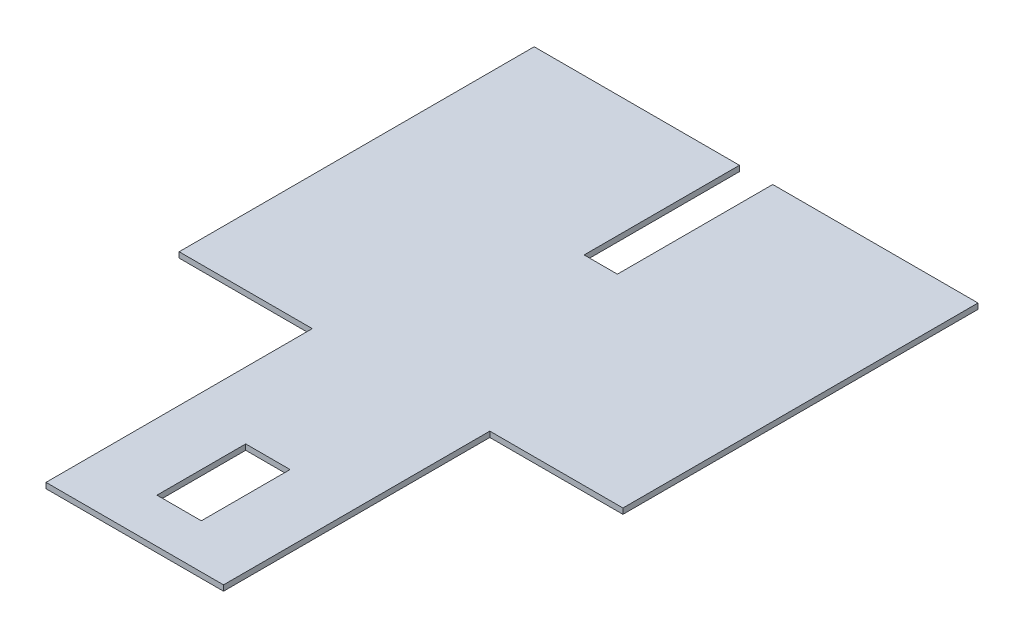
ISO-10303-21;
HEADER;
FILE_DESCRIPTION(('STEP AP214'),'2;1');
FILE_NAME('part.step','',(''),(''),'','','');
FILE_SCHEMA(('AUTOMOTIVE_DESIGN { 1 0 10303 214 1 1 1 1 }'));
ENDSEC;
DATA;
#1=APPLICATION_CONTEXT('core data for automotive mechanical design processes');
#2=APPLICATION_PROTOCOL_DEFINITION('international standard','automotive_design',2000,#1);
#3=PRODUCT_CONTEXT('',#1,'mechanical');
#4=PRODUCT('Part','Part','',(#3));
#5=PRODUCT_RELATED_PRODUCT_CATEGORY('part','',(#4));
#6=PRODUCT_DEFINITION_FORMATION('','',#4);
#7=PRODUCT_DEFINITION_CONTEXT('part definition',#1,'design');
#8=PRODUCT_DEFINITION('design','',#6,#7);
#9=PRODUCT_DEFINITION_SHAPE('','',#8);
#10=(LENGTH_UNIT() NAMED_UNIT(*) SI_UNIT(.MILLI.,.METRE.));
#11=(NAMED_UNIT(*) PLANE_ANGLE_UNIT() SI_UNIT($,.RADIAN.));
#12=(NAMED_UNIT(*) SI_UNIT($,.STERADIAN.) SOLID_ANGLE_UNIT());
#13=UNCERTAINTY_MEASURE_WITH_UNIT(LENGTH_MEASURE(1.E-05),#10,'distance_accuracy_value','');
#14=(GEOMETRIC_REPRESENTATION_CONTEXT(3) GLOBAL_UNCERTAINTY_ASSIGNED_CONTEXT((#13)) GLOBAL_UNIT_ASSIGNED_CONTEXT((#10,
#11,#12)) REPRESENTATION_CONTEXT('',''));
#15=CARTESIAN_POINT('',(0.,0.,0.));
#16=DIRECTION('',(0.,0.,1.));
#17=DIRECTION('',(1.,0.,0.));
#18=AXIS2_PLACEMENT_3D('',#15,#16,#17);
#19=CARTESIAN_POINT('',(-63.5,1.58750000000002,-88.9));
#20=DIRECTION('',(0.,0.,1.));
#21=DIRECTION('',(1.,0.,0.));
#22=AXIS2_PLACEMENT_3D('',#19,#20,#21);
#23=PLANE('',#22);
#24=DIRECTION('',(-1.,0.,0.));
#25=VECTOR('',#24,1.);
#26=CARTESIAN_POINT('',(-63.5,1.58750000000002,-88.9));
#27=LINE('',#26,#25);
#28=CARTESIAN_POINT('',(-4.7625,1.58750000000002,-88.9));
#29=VERTEX_POINT('',#28);
#30=CARTESIAN_POINT('',(-63.5,1.58750000000002,-88.9));
#31=VERTEX_POINT('',#30);
#32=EDGE_CURVE('E231',#29,#31,#27,.T.);
#33=ORIENTED_EDGE('',*,*,#32,.F.);
#34=DIRECTION('',(0.,1.,0.));
#35=VECTOR('',#34,1.);
#36=CARTESIAN_POINT('',(-4.7625,-0.00100000000002876,-88.9));
#37=LINE('',#36,#35);
#38=CARTESIAN_POINT('',(-4.7625,0.,-88.9));
#39=VERTEX_POINT('',#38);
#40=EDGE_CURVE('E167',#39,#29,#37,.T.);
#41=ORIENTED_EDGE('',*,*,#40,.F.);
#42=DIRECTION('',(-1.,0.,0.));
#43=VECTOR('',#42,1.);
#44=CARTESIAN_POINT('',(-63.5,0.,-88.9));
#45=LINE('',#44,#43);
#46=CARTESIAN_POINT('',(-63.5,0.,-88.9));
#47=VERTEX_POINT('',#46);
#48=EDGE_CURVE('E173',#39,#47,#45,.T.);
#49=ORIENTED_EDGE('',*,*,#48,.T.);
#50=DIRECTION('',(0.,-1.,0.));
#51=VECTOR('',#50,1.);
#52=CARTESIAN_POINT('',(-63.5,1.58750000000002,-88.9));
#53=LINE('',#52,#51);
#54=EDGE_CURVE('E235',#31,#47,#53,.T.);
#55=ORIENTED_EDGE('',*,*,#54,.F.);
#56=EDGE_LOOP('',(#33,#41,#49,#55));
#57=FACE_BOUND('',#56,.T.);
#58=ADVANCED_FACE('F36',(#57),#23,.F.);
#59=CARTESIAN_POINT('',(-63.5,1.58750000000002,-88.9));
#60=DIRECTION('',(1.,0.,0.));
#61=DIRECTION('',(0.,0.,-1.));
#62=AXIS2_PLACEMENT_3D('',#59,#60,#61);
#63=PLANE('',#62);
#64=DIRECTION('',(0.,0.,1.));
#65=VECTOR('',#64,1.);
#66=CARTESIAN_POINT('',(-63.5,0.,-88.9));
#67=LINE('',#66,#65);
#68=CARTESIAN_POINT('',(-63.5,0.,12.7));
#69=VERTEX_POINT('',#68);
#70=EDGE_CURVE('E214',#47,#69,#67,.T.);
#71=ORIENTED_EDGE('',*,*,#70,.T.);
#72=DIRECTION('',(0.,-1.,0.));
#73=VECTOR('',#72,1.);
#74=CARTESIAN_POINT('',(-63.5,1.58750000000002,12.7));
#75=LINE('',#74,#73);
#76=CARTESIAN_POINT('',(-63.5,1.58750000000002,12.7));
#77=VERTEX_POINT('',#76);
#78=EDGE_CURVE('E11',#77,#69,#75,.T.);
#79=ORIENTED_EDGE('',*,*,#78,.F.);
#80=DIRECTION('',(0.,0.,1.));
#81=VECTOR('',#80,1.);
#82=CARTESIAN_POINT('',(-63.5,1.58750000000002,-88.9));
#83=LINE('',#82,#81);
#84=EDGE_CURVE('E215',#31,#77,#83,.T.);
#85=ORIENTED_EDGE('',*,*,#84,.F.);
#86=ORIENTED_EDGE('',*,*,#54,.T.);
#87=EDGE_LOOP('',(#71,#79,#85,#86));
#88=FACE_BOUND('',#87,.T.);
#89=ADVANCED_FACE('F38',(#88),#63,.F.);
#90=CARTESIAN_POINT('',(-63.5,1.58750000000002,12.7));
#91=DIRECTION('',(0.,0.,-1.));
#92=DIRECTION('',(-1.,0.,0.));
#93=AXIS2_PLACEMENT_3D('',#90,#91,#92);
#94=PLANE('',#93);
#95=DIRECTION('',(1.,0.,0.));
#96=VECTOR('',#95,1.);
#97=CARTESIAN_POINT('',(-63.5,0.,12.7));
#98=LINE('',#97,#96);
#99=CARTESIAN_POINT('',(-25.4,0.,12.7));
#100=VERTEX_POINT('',#99);
#101=EDGE_CURVE('E238',#69,#100,#98,.T.);
#102=ORIENTED_EDGE('',*,*,#101,.T.);
#103=DIRECTION('',(0.,-1.,0.));
#104=VECTOR('',#103,1.);
#105=CARTESIAN_POINT('',(-25.4,1.58750000000002,12.7));
#106=LINE('',#105,#104);
#107=CARTESIAN_POINT('',(-25.4,1.58750000000002,12.7));
#108=VERTEX_POINT('',#107);
#109=EDGE_CURVE('E44',#108,#100,#106,.T.);
#110=ORIENTED_EDGE('',*,*,#109,.F.);
#111=DIRECTION('',(1.,0.,0.));
#112=VECTOR('',#111,1.);
#113=CARTESIAN_POINT('',(-63.5,1.58750000000002,12.7));
#114=LINE('',#113,#112);
#115=EDGE_CURVE('E218',#77,#108,#114,.T.);
#116=ORIENTED_EDGE('',*,*,#115,.F.);
#117=ORIENTED_EDGE('',*,*,#78,.T.);
#118=EDGE_LOOP('',(#102,#110,#116,#117));
#119=FACE_BOUND('',#118,.T.);
#120=ADVANCED_FACE('F294',(#119),#94,.F.);
#121=CARTESIAN_POINT('',(-25.4,1.58750000000002,12.7));
#122=DIRECTION('',(1.,0.,0.));
#123=DIRECTION('',(0.,0.,-1.));
#124=AXIS2_PLACEMENT_3D('',#121,#122,#123);
#125=PLANE('',#124);
#126=DIRECTION('',(0.,0.,1.));
#127=VECTOR('',#126,1.);
#128=CARTESIAN_POINT('',(-25.4,0.,12.7));
#129=LINE('',#128,#127);
#130=CARTESIAN_POINT('',(-25.4000000000001,0.,88.9));
#131=VERTEX_POINT('',#130);
#132=EDGE_CURVE('E240',#100,#131,#129,.T.);
#133=ORIENTED_EDGE('',*,*,#132,.T.);
#134=DIRECTION('',(0.,-1.,0.));
#135=VECTOR('',#134,1.);
#136=CARTESIAN_POINT('',(-25.4000000000001,1.58750000000002,88.9));
#137=LINE('',#136,#135);
#138=CARTESIAN_POINT('',(-25.4000000000001,1.58750000000002,88.9));
#139=VERTEX_POINT('',#138);
#140=EDGE_CURVE('E266',#139,#131,#137,.T.);
#141=ORIENTED_EDGE('',*,*,#140,.F.);
#142=DIRECTION('',(0.,0.,1.));
#143=VECTOR('',#142,1.);
#144=CARTESIAN_POINT('',(-25.4,1.58750000000002,12.7));
#145=LINE('',#144,#143);
#146=EDGE_CURVE('E221',#108,#139,#145,.T.);
#147=ORIENTED_EDGE('',*,*,#146,.F.);
#148=ORIENTED_EDGE('',*,*,#109,.T.);
#149=EDGE_LOOP('',(#133,#141,#147,#148));
#150=FACE_BOUND('',#149,.T.);
#151=ADVANCED_FACE('F273',(#150),#125,.F.);
#152=CARTESIAN_POINT('',(-25.4000000000001,1.58750000000002,88.9));
#153=DIRECTION('',(0.,0.,-1.));
#154=DIRECTION('',(-1.,0.,0.));
#155=AXIS2_PLACEMENT_3D('',#152,#153,#154);
#156=PLANE('',#155);
#157=DIRECTION('',(1.,0.,0.));
#158=VECTOR('',#157,1.);
#159=CARTESIAN_POINT('',(-25.4000000000001,0.,88.9));
#160=LINE('',#159,#158);
#161=CARTESIAN_POINT('',(25.3999999999999,0.,88.9));
#162=VERTEX_POINT('',#161);
#163=EDGE_CURVE('E242',#131,#162,#160,.T.);
#164=ORIENTED_EDGE('',*,*,#163,.T.);
#165=DIRECTION('',(0.,-1.,0.));
#166=VECTOR('',#165,1.);
#167=CARTESIAN_POINT('',(25.3999999999999,1.58750000000002,88.9));
#168=LINE('',#167,#166);
#169=CARTESIAN_POINT('',(25.3999999999999,1.58750000000002,88.9));
#170=VERTEX_POINT('',#169);
#171=EDGE_CURVE('E263',#170,#162,#168,.T.);
#172=ORIENTED_EDGE('',*,*,#171,.F.);
#173=DIRECTION('',(1.,0.,0.));
#174=VECTOR('',#173,1.);
#175=CARTESIAN_POINT('',(-25.4000000000001,1.58750000000002,88.9));
#176=LINE('',#175,#174);
#177=EDGE_CURVE('E223',#139,#170,#176,.T.);
#178=ORIENTED_EDGE('',*,*,#177,.F.);
#179=ORIENTED_EDGE('',*,*,#140,.T.);
#180=EDGE_LOOP('',(#164,#172,#178,#179));
#181=FACE_BOUND('',#180,.T.);
#182=ADVANCED_FACE('F281',(#181),#156,.F.);
#183=CARTESIAN_POINT('',(25.3999999999999,1.58750000000002,88.9));
#184=DIRECTION('',(-1.,0.,0.));
#185=DIRECTION('',(0.,0.,1.));
#186=AXIS2_PLACEMENT_3D('',#183,#184,#185);
#187=PLANE('',#186);
#188=DIRECTION('',(0.,0.,-1.));
#189=VECTOR('',#188,1.);
#190=CARTESIAN_POINT('',(25.3999999999999,0.,88.9));
#191=LINE('',#190,#189);
#192=CARTESIAN_POINT('',(25.4,0.,12.7));
#193=VERTEX_POINT('',#192);
#194=EDGE_CURVE('E244',#162,#193,#191,.T.);
#195=ORIENTED_EDGE('',*,*,#194,.T.);
#196=DIRECTION('',(0.,-1.,0.));
#197=VECTOR('',#196,1.);
#198=CARTESIAN_POINT('',(25.4,1.58750000000002,12.7));
#199=LINE('',#198,#197);
#200=CARTESIAN_POINT('',(25.4,1.58750000000002,12.7));
#201=VERTEX_POINT('',#200);
#202=EDGE_CURVE('E260',#201,#193,#199,.T.);
#203=ORIENTED_EDGE('',*,*,#202,.F.);
#204=DIRECTION('',(0.,0.,-1.));
#205=VECTOR('',#204,1.);
#206=CARTESIAN_POINT('',(25.3999999999999,1.58750000000002,88.9));
#207=LINE('',#206,#205);
#208=EDGE_CURVE('E225',#170,#201,#207,.T.);
#209=ORIENTED_EDGE('',*,*,#208,.F.);
#210=ORIENTED_EDGE('',*,*,#171,.T.);
#211=EDGE_LOOP('',(#195,#203,#209,#210));
#212=FACE_BOUND('',#211,.T.);
#213=ADVANCED_FACE('F285',(#212),#187,.F.);
#214=CARTESIAN_POINT('',(25.4,1.58750000000002,12.7));
#215=DIRECTION('',(0.,0.,-1.));
#216=DIRECTION('',(-1.,0.,0.));
#217=AXIS2_PLACEMENT_3D('',#214,#215,#216);
#218=PLANE('',#217);
#219=DIRECTION('',(1.,0.,0.));
#220=VECTOR('',#219,1.);
#221=CARTESIAN_POINT('',(25.4,0.,12.7));
#222=LINE('',#221,#220);
#223=CARTESIAN_POINT('',(63.4999999999999,0.,12.7));
#224=VERTEX_POINT('',#223);
#225=EDGE_CURVE('E246',#193,#224,#222,.T.);
#226=ORIENTED_EDGE('',*,*,#225,.T.);
#227=DIRECTION('',(0.,-1.,0.));
#228=VECTOR('',#227,1.);
#229=CARTESIAN_POINT('',(63.4999999999999,1.58750000000002,12.7));
#230=LINE('',#229,#228);
#231=CARTESIAN_POINT('',(63.4999999999999,1.58750000000002,12.7));
#232=VERTEX_POINT('',#231);
#233=EDGE_CURVE('E257',#232,#224,#230,.T.);
#234=ORIENTED_EDGE('',*,*,#233,.F.);
#235=DIRECTION('',(1.,0.,0.));
#236=VECTOR('',#235,1.);
#237=CARTESIAN_POINT('',(25.4,1.58750000000002,12.7));
#238=LINE('',#237,#236);
#239=EDGE_CURVE('E227',#201,#232,#238,.T.);
#240=ORIENTED_EDGE('',*,*,#239,.F.);
#241=ORIENTED_EDGE('',*,*,#202,.T.);
#242=EDGE_LOOP('',(#226,#234,#240,#241));
#243=FACE_BOUND('',#242,.T.);
#244=ADVANCED_FACE('F311',(#243),#218,.F.);
#245=CARTESIAN_POINT('',(63.5,1.58750000000002,-88.9));
#246=DIRECTION('',(-1.,0.,0.));
#247=DIRECTION('',(0.,0.,1.));
#248=AXIS2_PLACEMENT_3D('',#245,#246,#247);
#249=PLANE('',#248);
#250=DIRECTION('',(0.,0.,-1.));
#251=VECTOR('',#250,1.);
#252=CARTESIAN_POINT('',(63.5,0.,-88.9));
#253=LINE('',#252,#251);
#254=CARTESIAN_POINT('',(63.5,0.,-88.9));
#255=VERTEX_POINT('',#254);
#256=EDGE_CURVE('E248',#224,#255,#253,.T.);
#257=ORIENTED_EDGE('',*,*,#256,.T.);
#258=DIRECTION('',(0.,-1.,0.));
#259=VECTOR('',#258,1.);
#260=CARTESIAN_POINT('',(63.5,1.58750000000002,-88.9));
#261=LINE('',#260,#259);
#262=CARTESIAN_POINT('',(63.5,1.58750000000002,-88.9));
#263=VERTEX_POINT('',#262);
#264=EDGE_CURVE('E254',#263,#255,#261,.T.);
#265=ORIENTED_EDGE('',*,*,#264,.F.);
#266=DIRECTION('',(0.,0.,-1.));
#267=VECTOR('',#266,1.);
#268=CARTESIAN_POINT('',(63.5,1.58750000000002,-88.9));
#269=LINE('',#268,#267);
#270=EDGE_CURVE('E229',#232,#263,#269,.T.);
#271=ORIENTED_EDGE('',*,*,#270,.F.);
#272=ORIENTED_EDGE('',*,*,#233,.T.);
#273=EDGE_LOOP('',(#257,#265,#271,#272));
#274=FACE_BOUND('',#273,.T.);
#275=ADVANCED_FACE('F308',(#274),#249,.F.);
#276=CARTESIAN_POINT('',(4.7625,0.,-88.9));
#277=VERTEX_POINT('',#276);
#278=EDGE_CURVE('E219',#255,#277,#45,.T.);
#279=ORIENTED_EDGE('',*,*,#278,.T.);
#280=DIRECTION('',(0.,1.,0.));
#281=VECTOR('',#280,1.);
#282=CARTESIAN_POINT('',(4.7625,-0.00100000000002876,-88.9));
#283=LINE('',#282,#281);
#284=CARTESIAN_POINT('',(4.7625,1.58750000000002,-88.9));
#285=VERTEX_POINT('',#284);
#286=EDGE_CURVE('E182',#277,#285,#283,.T.);
#287=ORIENTED_EDGE('',*,*,#286,.T.);
#288=EDGE_CURVE('E232',#263,#285,#27,.T.);
#289=ORIENTED_EDGE('',*,*,#288,.F.);
#290=ORIENTED_EDGE('',*,*,#264,.T.);
#291=EDGE_LOOP('',(#279,#287,#289,#290));
#292=FACE_BOUND('',#291,.T.);
#293=ADVANCED_FACE('F303',(#292),#23,.F.);
#294=CARTESIAN_POINT('',(0.,1.58750000000002,0.));
#295=DIRECTION('',(0.,1.,0.));
#296=DIRECTION('',(0.,0.,1.));
#297=AXIS2_PLACEMENT_3D('',#294,#295,#296);
#298=PLANE('',#297);
#299=DIRECTION('',(0.,0.,1.));
#300=VECTOR('',#299,1.);
#301=CARTESIAN_POINT('',(-4.7625,1.58750000000002,-88.9));
#302=LINE('',#301,#300);
#303=CARTESIAN_POINT('',(-4.76250000000011,1.58750000000002,-44.45));
#304=VERTEX_POINT('',#303);
#305=EDGE_CURVE('E155',#29,#304,#302,.T.);
#306=ORIENTED_EDGE('',*,*,#305,.F.);
#307=ORIENTED_EDGE('',*,*,#32,.T.);
#308=ORIENTED_EDGE('',*,*,#84,.T.);
#309=ORIENTED_EDGE('',*,*,#115,.T.);
#310=ORIENTED_EDGE('',*,*,#146,.T.);
#311=ORIENTED_EDGE('',*,*,#177,.T.);
#312=ORIENTED_EDGE('',*,*,#208,.T.);
#313=ORIENTED_EDGE('',*,*,#239,.T.);
#314=ORIENTED_EDGE('',*,*,#270,.T.);
#315=ORIENTED_EDGE('',*,*,#288,.T.);
#316=DIRECTION('',(0.,0.,-1.));
#317=VECTOR('',#316,1.);
#318=CARTESIAN_POINT('',(4.7625,1.58750000000002,-88.9));
#319=LINE('',#318,#317);
#320=CARTESIAN_POINT('',(4.76249999999989,1.58750000000002,-44.45));
#321=VERTEX_POINT('',#320);
#322=EDGE_CURVE('E160',#321,#285,#319,.T.);
#323=ORIENTED_EDGE('',*,*,#322,.F.);
#324=DIRECTION('',(1.,0.,0.));
#325=VECTOR('',#324,1.);
#326=CARTESIAN_POINT('',(-4.76250000000011,1.58750000000002,-44.45));
#327=LINE('',#326,#325);
#328=EDGE_CURVE('E175',#304,#321,#327,.T.);
#329=ORIENTED_EDGE('',*,*,#328,.F.);
#330=EDGE_LOOP('',(#306,#307,#308,#309,#310,#311,#312,#313,#314,#315,#323,#329));
#331=FACE_BOUND('',#330,.T.);
#332=DIRECTION('',(0.,0.,-1.));
#333=VECTOR('',#332,1.);
#334=CARTESIAN_POINT('',(6.34999999999999,1.58750000000002,76.2));
#335=LINE('',#334,#333);
#336=CARTESIAN_POINT('',(6.34999999999999,1.58750000000002,76.2));
#337=VERTEX_POINT('',#336);
#338=CARTESIAN_POINT('',(6.34999999999988,1.58750000000002,50.8));
#339=VERTEX_POINT('',#338);
#340=EDGE_CURVE('E59',#337,#339,#335,.T.);
#341=ORIENTED_EDGE('',*,*,#340,.F.);
#342=DIRECTION('',(1.,0.,0.));
#343=VECTOR('',#342,1.);
#344=CARTESIAN_POINT('',(6.34999999999999,1.58750000000002,76.2));
#345=LINE('',#344,#343);
#346=CARTESIAN_POINT('',(-6.35000000000002,1.58750000000002,76.2));
#347=VERTEX_POINT('',#346);
#348=EDGE_CURVE('E200',#347,#337,#345,.T.);
#349=ORIENTED_EDGE('',*,*,#348,.F.);
#350=DIRECTION('',(0.,0.,1.));
#351=VECTOR('',#350,1.);
#352=CARTESIAN_POINT('',(-6.35000000000002,1.58750000000002,76.2));
#353=LINE('',#352,#351);
#354=CARTESIAN_POINT('',(-6.35000000000013,1.58750000000002,50.8));
#355=VERTEX_POINT('',#354);
#356=EDGE_CURVE('E197',#355,#347,#353,.T.);
#357=ORIENTED_EDGE('',*,*,#356,.F.);
#358=DIRECTION('',(-1.,0.,0.));
#359=VECTOR('',#358,1.);
#360=CARTESIAN_POINT('',(6.34999999999988,1.58750000000002,50.8));
#361=LINE('',#360,#359);
#362=EDGE_CURVE('E194',#339,#355,#361,.T.);
#363=ORIENTED_EDGE('',*,*,#362,.F.);
#364=EDGE_LOOP('',(#341,#349,#357,#363));
#365=FACE_BOUND('',#364,.T.);
#366=ADVANCED_FACE('F289',(#331,#365),#298,.T.);
#367=CARTESIAN_POINT('',(0.,0.,0.));
#368=DIRECTION('',(0.,1.,0.));
#369=DIRECTION('',(0.,0.,1.));
#370=AXIS2_PLACEMENT_3D('',#367,#368,#369);
#371=PLANE('',#370);
#372=ORIENTED_EDGE('',*,*,#48,.F.);
#373=DIRECTION('',(0.,0.,-1.));
#374=VECTOR('',#373,1.);
#375=CARTESIAN_POINT('',(-4.7625,0.,-88.9));
#376=LINE('',#375,#374);
#377=CARTESIAN_POINT('',(-4.76250000000011,0.,-44.45));
#378=VERTEX_POINT('',#377);
#379=EDGE_CURVE('E152',#378,#39,#376,.T.);
#380=ORIENTED_EDGE('',*,*,#379,.F.);
#381=DIRECTION('',(-1.,0.,0.));
#382=VECTOR('',#381,1.);
#383=CARTESIAN_POINT('',(-4.76250000000011,0.,-44.45));
#384=LINE('',#383,#382);
#385=CARTESIAN_POINT('',(4.76249999999989,0.,-44.45));
#386=VERTEX_POINT('',#385);
#387=EDGE_CURVE('E163',#386,#378,#384,.T.);
#388=ORIENTED_EDGE('',*,*,#387,.F.);
#389=DIRECTION('',(0.,0.,1.));
#390=VECTOR('',#389,1.);
#391=CARTESIAN_POINT('',(4.7625,0.,-88.9));
#392=LINE('',#391,#390);
#393=EDGE_CURVE('E51',#277,#386,#392,.T.);
#394=ORIENTED_EDGE('',*,*,#393,.F.);
#395=ORIENTED_EDGE('',*,*,#278,.F.);
#396=ORIENTED_EDGE('',*,*,#256,.F.);
#397=ORIENTED_EDGE('',*,*,#225,.F.);
#398=ORIENTED_EDGE('',*,*,#194,.F.);
#399=ORIENTED_EDGE('',*,*,#163,.F.);
#400=ORIENTED_EDGE('',*,*,#132,.F.);
#401=ORIENTED_EDGE('',*,*,#101,.F.);
#402=ORIENTED_EDGE('',*,*,#70,.F.);
#403=EDGE_LOOP('',(#372,#380,#388,#394,#395,#396,#397,#398,#399,#400,#401,#402));
#404=FACE_BOUND('',#403,.T.);
#405=DIRECTION('',(-1.,0.,0.));
#406=VECTOR('',#405,1.);
#407=CARTESIAN_POINT('',(6.34999999999999,0.,76.2));
#408=LINE('',#407,#406);
#409=CARTESIAN_POINT('',(6.34999999999999,0.,76.2));
#410=VERTEX_POINT('',#409);
#411=CARTESIAN_POINT('',(-6.35000000000002,0.,76.2));
#412=VERTEX_POINT('',#411);
#413=EDGE_CURVE('E187',#410,#412,#408,.T.);
#414=ORIENTED_EDGE('',*,*,#413,.F.);
#415=DIRECTION('',(0.,0.,1.));
#416=VECTOR('',#415,1.);
#417=CARTESIAN_POINT('',(6.34999999999999,0.,76.2));
#418=LINE('',#417,#416);
#419=CARTESIAN_POINT('',(6.34999999999988,0.,50.8));
#420=VERTEX_POINT('',#419);
#421=EDGE_CURVE('E190',#420,#410,#418,.T.);
#422=ORIENTED_EDGE('',*,*,#421,.F.);
#423=DIRECTION('',(1.,0.,0.));
#424=VECTOR('',#423,1.);
#425=CARTESIAN_POINT('',(6.34999999999988,0.,50.8));
#426=LINE('',#425,#424);
#427=CARTESIAN_POINT('',(-6.35000000000013,0.,50.8));
#428=VERTEX_POINT('',#427);
#429=EDGE_CURVE('E206',#428,#420,#426,.T.);
#430=ORIENTED_EDGE('',*,*,#429,.F.);
#431=DIRECTION('',(0.,0.,-1.));
#432=VECTOR('',#431,1.);
#433=CARTESIAN_POINT('',(-6.35000000000002,0.,76.2));
#434=LINE('',#433,#432);
#435=EDGE_CURVE('E166',#412,#428,#434,.T.);
#436=ORIENTED_EDGE('',*,*,#435,.F.);
#437=EDGE_LOOP('',(#414,#422,#430,#436));
#438=FACE_BOUND('',#437,.T.);
#439=ADVANCED_FACE('F170',(#404,#438),#371,.F.);
#440=CARTESIAN_POINT('',(6.34999999999999,-0.00100000000002876,76.2));
#441=DIRECTION('',(1.,0.,0.));
#442=DIRECTION('',(0.,0.,-1.));
#443=AXIS2_PLACEMENT_3D('',#440,#441,#442);
#444=PLANE('',#443);
#445=ORIENTED_EDGE('',*,*,#421,.T.);
#446=DIRECTION('',(0.,1.,0.));
#447=VECTOR('',#446,1.);
#448=CARTESIAN_POINT('',(6.34999999999999,-0.00100000000002876,76.2));
#449=LINE('',#448,#447);
#450=EDGE_CURVE('E204',#410,#337,#449,.T.);
#451=ORIENTED_EDGE('',*,*,#450,.T.);
#452=ORIENTED_EDGE('',*,*,#340,.T.);
#453=DIRECTION('',(0.,1.,0.));
#454=VECTOR('',#453,1.);
#455=CARTESIAN_POINT('',(6.34999999999988,-0.00100000000002876,50.8));
#456=LINE('',#455,#454);
#457=EDGE_CURVE('E203',#420,#339,#456,.T.);
#458=ORIENTED_EDGE('',*,*,#457,.F.);
#459=EDGE_LOOP('',(#445,#451,#452,#458));
#460=FACE_BOUND('',#459,.T.);
#461=ADVANCED_FACE('F334',(#460),#444,.F.);
#462=CARTESIAN_POINT('',(6.34999999999999,-0.00100000000002876,76.2));
#463=DIRECTION('',(0.,0.,1.));
#464=DIRECTION('',(1.,0.,0.));
#465=AXIS2_PLACEMENT_3D('',#462,#463,#464);
#466=PLANE('',#465);
#467=ORIENTED_EDGE('',*,*,#413,.T.);
#468=DIRECTION('',(0.,1.,0.));
#469=VECTOR('',#468,1.);
#470=CARTESIAN_POINT('',(-6.35000000000002,-0.00100000000002876,76.2));
#471=LINE('',#470,#469);
#472=EDGE_CURVE('E207',#412,#347,#471,.T.);
#473=ORIENTED_EDGE('',*,*,#472,.T.);
#474=ORIENTED_EDGE('',*,*,#348,.T.);
#475=ORIENTED_EDGE('',*,*,#450,.F.);
#476=EDGE_LOOP('',(#467,#473,#474,#475));
#477=FACE_BOUND('',#476,.T.);
#478=ADVANCED_FACE('F338',(#477),#466,.F.);
#479=CARTESIAN_POINT('',(-6.35000000000002,-0.00100000000002876,76.2));
#480=DIRECTION('',(-1.,0.,0.));
#481=DIRECTION('',(0.,0.,1.));
#482=AXIS2_PLACEMENT_3D('',#479,#480,#481);
#483=PLANE('',#482);
#484=ORIENTED_EDGE('',*,*,#435,.T.);
#485=DIRECTION('',(0.,1.,0.));
#486=VECTOR('',#485,1.);
#487=CARTESIAN_POINT('',(-6.35000000000013,-0.00100000000002876,50.8));
#488=LINE('',#487,#486);
#489=EDGE_CURVE('E209',#428,#355,#488,.T.);
#490=ORIENTED_EDGE('',*,*,#489,.T.);
#491=ORIENTED_EDGE('',*,*,#356,.T.);
#492=ORIENTED_EDGE('',*,*,#472,.F.);
#493=EDGE_LOOP('',(#484,#490,#491,#492));
#494=FACE_BOUND('',#493,.T.);
#495=ADVANCED_FACE('F342',(#494),#483,.F.);
#496=CARTESIAN_POINT('',(6.34999999999988,-0.00100000000002876,50.8));
#497=DIRECTION('',(0.,0.,-1.));
#498=DIRECTION('',(-1.,0.,0.));
#499=AXIS2_PLACEMENT_3D('',#496,#497,#498);
#500=PLANE('',#499);
#501=ORIENTED_EDGE('',*,*,#429,.T.);
#502=ORIENTED_EDGE('',*,*,#457,.T.);
#503=ORIENTED_EDGE('',*,*,#362,.T.);
#504=ORIENTED_EDGE('',*,*,#489,.F.);
#505=EDGE_LOOP('',(#501,#502,#503,#504));
#506=FACE_BOUND('',#505,.T.);
#507=ADVANCED_FACE('F339',(#506),#500,.F.);
#508=CARTESIAN_POINT('',(-4.7625,-0.00100000000002876,-88.9));
#509=DIRECTION('',(-1.,0.,0.));
#510=DIRECTION('',(0.,0.,1.));
#511=AXIS2_PLACEMENT_3D('',#508,#509,#510);
#512=PLANE('',#511);
#513=ORIENTED_EDGE('',*,*,#379,.T.);
#514=ORIENTED_EDGE('',*,*,#40,.T.);
#515=ORIENTED_EDGE('',*,*,#305,.T.);
#516=DIRECTION('',(0.,1.,0.));
#517=VECTOR('',#516,1.);
#518=CARTESIAN_POINT('',(-4.76250000000011,-0.00100000000002876,-44.45));
#519=LINE('',#518,#517);
#520=EDGE_CURVE('E148',#378,#304,#519,.T.);
#521=ORIENTED_EDGE('',*,*,#520,.F.);
#522=EDGE_LOOP('',(#513,#514,#515,#521));
#523=FACE_BOUND('',#522,.T.);
#524=ADVANCED_FACE('F150',(#523),#512,.F.);
#525=CARTESIAN_POINT('',(4.7625,-0.00100000000002876,-88.9));
#526=DIRECTION('',(1.,0.,0.));
#527=DIRECTION('',(0.,0.,-1.));
#528=AXIS2_PLACEMENT_3D('',#525,#526,#527);
#529=PLANE('',#528);
#530=ORIENTED_EDGE('',*,*,#393,.T.);
#531=DIRECTION('',(0.,1.,0.));
#532=VECTOR('',#531,1.);
#533=CARTESIAN_POINT('',(4.76249999999989,-0.00100000000002876,-44.45));
#534=LINE('',#533,#532);
#535=EDGE_CURVE('E159',#386,#321,#534,.T.);
#536=ORIENTED_EDGE('',*,*,#535,.T.);
#537=ORIENTED_EDGE('',*,*,#322,.T.);
#538=ORIENTED_EDGE('',*,*,#286,.F.);
#539=EDGE_LOOP('',(#530,#536,#537,#538));
#540=FACE_BOUND('',#539,.T.);
#541=ADVANCED_FACE('F301',(#540),#529,.F.);
#542=CARTESIAN_POINT('',(-4.76250000000011,-0.00100000000002876,-44.45));
#543=DIRECTION('',(0.,0.,1.));
#544=DIRECTION('',(1.,0.,0.));
#545=AXIS2_PLACEMENT_3D('',#542,#543,#544);
#546=PLANE('',#545);
#547=ORIENTED_EDGE('',*,*,#387,.T.);
#548=ORIENTED_EDGE('',*,*,#520,.T.);
#549=ORIENTED_EDGE('',*,*,#328,.T.);
#550=ORIENTED_EDGE('',*,*,#535,.F.);
#551=EDGE_LOOP('',(#547,#548,#549,#550));
#552=FACE_BOUND('',#551,.T.);
#553=ADVANCED_FACE('F164',(#552),#546,.F.);
#554=CLOSED_SHELL('',(#58,#89,#120,#151,#182,#213,#244,#275,#293,#366,#439,#461,#478,#495,#507,
#524,#541,#553));
#555=MANIFOLD_SOLID_BREP('B2',#554);
#556=ADVANCED_BREP_SHAPE_REPRESENTATION('',(#18,#555),#14);
#557=SHAPE_DEFINITION_REPRESENTATION(#9,#556);
ENDSEC;
END-ISO-10303-21;
